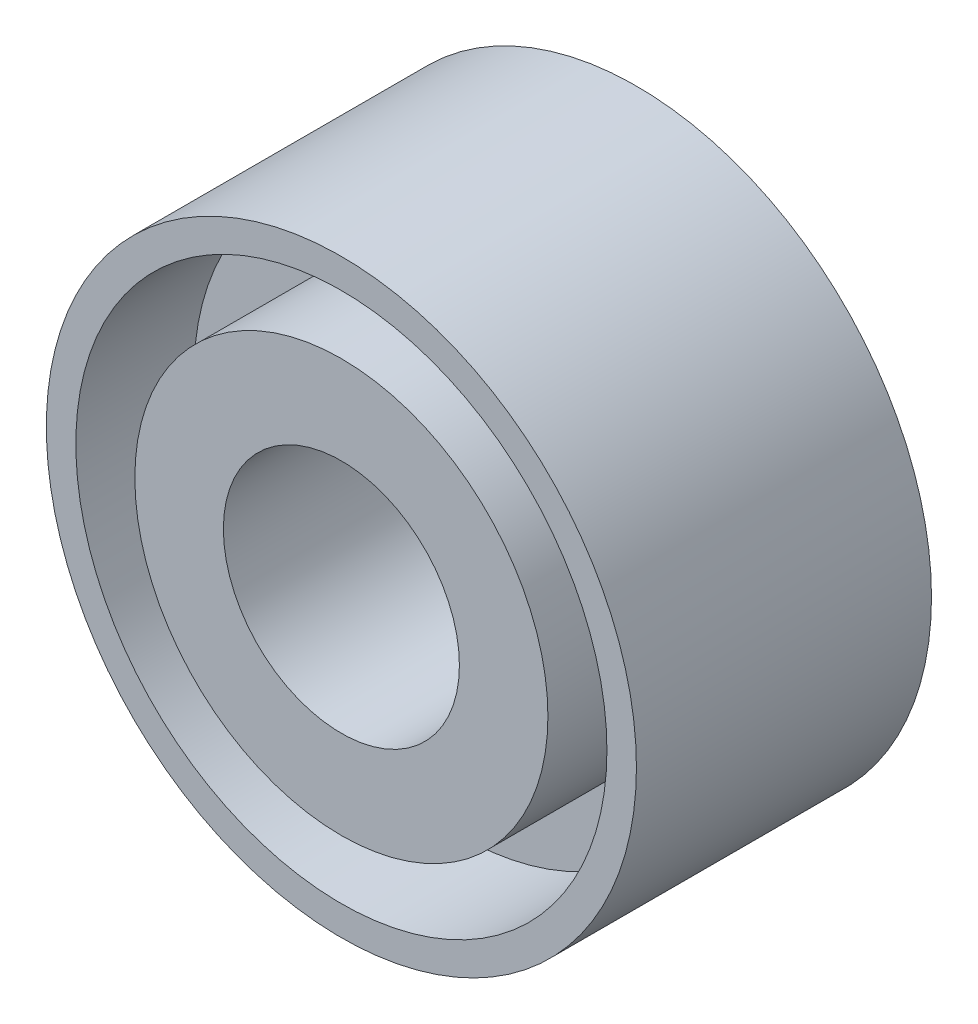
ISO-10303-21;
HEADER;
FILE_DESCRIPTION(('STEP AP214'),'2;1');
FILE_NAME('part.step','',(''),(''),'','','');
FILE_SCHEMA(('AUTOMOTIVE_DESIGN { 1 0 10303 214 1 1 1 1 }'));
ENDSEC;
DATA;
#1=APPLICATION_CONTEXT('core data for automotive mechanical design processes');
#2=APPLICATION_PROTOCOL_DEFINITION('international standard','automotive_design',2000,#1);
#3=PRODUCT_CONTEXT('',#1,'mechanical');
#4=PRODUCT('Part','Part','',(#3));
#5=PRODUCT_RELATED_PRODUCT_CATEGORY('part','',(#4));
#6=PRODUCT_DEFINITION_FORMATION('','',#4);
#7=PRODUCT_DEFINITION_CONTEXT('part definition',#1,'design');
#8=PRODUCT_DEFINITION('design','',#6,#7);
#9=PRODUCT_DEFINITION_SHAPE('','',#8);
#10=(LENGTH_UNIT() NAMED_UNIT(*) SI_UNIT(.MILLI.,.METRE.));
#11=(NAMED_UNIT(*) PLANE_ANGLE_UNIT() SI_UNIT($,.RADIAN.));
#12=(NAMED_UNIT(*) SI_UNIT($,.STERADIAN.) SOLID_ANGLE_UNIT());
#13=UNCERTAINTY_MEASURE_WITH_UNIT(LENGTH_MEASURE(1.E-05),#10,'distance_accuracy_value','');
#14=(GEOMETRIC_REPRESENTATION_CONTEXT(3) GLOBAL_UNCERTAINTY_ASSIGNED_CONTEXT((#13)) GLOBAL_UNIT_ASSIGNED_CONTEXT((#10,
#11,#12)) REPRESENTATION_CONTEXT('',''));
#15=CARTESIAN_POINT('',(0.,0.,0.));
#16=DIRECTION('',(0.,0.,1.));
#17=DIRECTION('',(1.,0.,0.));
#18=AXIS2_PLACEMENT_3D('',#15,#16,#17);
#19=CARTESIAN_POINT('',(0.,0.,5.));
#20=DIRECTION('',(0.,0.,1.));
#21=DIRECTION('',(1.,0.,0.));
#22=AXIS2_PLACEMENT_3D('',#19,#20,#21);
#23=PLANE('',#22);
#24=CARTESIAN_POINT('',(0.,0.,5.));
#25=DIRECTION('',(0.,0.,1.));
#26=DIRECTION('',(1.,0.,0.));
#27=AXIS2_PLACEMENT_3D('',#24,#25,#26);
#28=CIRCLE('',#27,2.);
#29=CARTESIAN_POINT('',(2.,0.,5.));
#30=VERTEX_POINT('',#29);
#31=EDGE_CURVE('E62',#30,#30,#28,.T.);
#32=ORIENTED_EDGE('',*,*,#31,.F.);
#33=EDGE_LOOP('',(#32));
#34=FACE_BOUND('',#33,.T.);
#35=CARTESIAN_POINT('',(0.,0.,5.));
#36=DIRECTION('',(0.,0.,1.));
#37=DIRECTION('',(1.,0.,0.));
#38=AXIS2_PLACEMENT_3D('',#35,#36,#37);
#39=CIRCLE('',#38,3.5);
#40=CARTESIAN_POINT('',(3.5,0.,5.));
#41=VERTEX_POINT('',#40);
#42=EDGE_CURVE('E80',#41,#41,#39,.T.);
#43=ORIENTED_EDGE('',*,*,#42,.T.);
#44=EDGE_LOOP('',(#43));
#45=FACE_BOUND('',#44,.T.);
#46=ADVANCED_FACE('F49',(#34,#45),#23,.T.);
#47=CARTESIAN_POINT('',(0.,0.,5.));
#48=DIRECTION('',(0.,0.,1.));
#49=DIRECTION('',(1.,0.,0.));
#50=AXIS2_PLACEMENT_3D('',#47,#48,#49);
#51=CIRCLE('',#50,4.5);
#52=CARTESIAN_POINT('',(4.5,0.,5.));
#53=VERTEX_POINT('',#52);
#54=EDGE_CURVE('E72',#53,#53,#51,.T.);
#55=ORIENTED_EDGE('',*,*,#54,.F.);
#56=EDGE_LOOP('',(#55));
#57=FACE_BOUND('',#56,.T.);
#58=CARTESIAN_POINT('',(0.,0.,5.));
#59=DIRECTION('',(0.,0.,1.));
#60=DIRECTION('',(1.,0.,0.));
#61=AXIS2_PLACEMENT_3D('',#58,#59,#60);
#62=CIRCLE('',#61,5.);
#63=CARTESIAN_POINT('',(5.,0.,5.));
#64=VERTEX_POINT('',#63);
#65=EDGE_CURVE('E11',#64,#64,#62,.T.);
#66=ORIENTED_EDGE('',*,*,#65,.T.);
#67=EDGE_LOOP('',(#66));
#68=FACE_BOUND('',#67,.T.);
#69=ADVANCED_FACE('F104',(#57,#68),#23,.T.);
#70=CARTESIAN_POINT('',(0.,0.,0.));
#71=DIRECTION('',(0.,0.,1.));
#72=DIRECTION('',(1.,0.,0.));
#73=AXIS2_PLACEMENT_3D('',#70,#71,#72);
#74=PLANE('',#73);
#75=CARTESIAN_POINT('',(0.,0.,0.));
#76=DIRECTION('',(0.,0.,1.));
#77=DIRECTION('',(1.,0.,0.));
#78=AXIS2_PLACEMENT_3D('',#75,#76,#77);
#79=CIRCLE('',#78,5.);
#80=CARTESIAN_POINT('',(5.,0.,0.));
#81=VERTEX_POINT('',#80);
#82=EDGE_CURVE('E53',#81,#81,#79,.T.);
#83=ORIENTED_EDGE('',*,*,#82,.F.);
#84=EDGE_LOOP('',(#83));
#85=FACE_BOUND('',#84,.T.);
#86=CARTESIAN_POINT('',(0.,0.,0.));
#87=DIRECTION('',(0.,0.,1.));
#88=DIRECTION('',(1.,0.,0.));
#89=AXIS2_PLACEMENT_3D('',#86,#87,#88);
#90=CIRCLE('',#89,2.);
#91=CARTESIAN_POINT('',(2.,0.,0.));
#92=VERTEX_POINT('',#91);
#93=EDGE_CURVE('E64',#92,#92,#90,.T.);
#94=ORIENTED_EDGE('',*,*,#93,.T.);
#95=EDGE_LOOP('',(#94));
#96=FACE_BOUND('',#95,.T.);
#97=ADVANCED_FACE('F106',(#85,#96),#74,.F.);
#98=CARTESIAN_POINT('',(0.,0.,5.));
#99=DIRECTION('',(0.,0.,-1.));
#100=DIRECTION('',(-1.,0.,0.));
#101=AXIS2_PLACEMENT_3D('',#98,#99,#100);
#102=CYLINDRICAL_SURFACE('',#101,5.);
#103=ORIENTED_EDGE('',*,*,#65,.F.);
#104=EDGE_LOOP('',(#103));
#105=FACE_BOUND('',#104,.T.);
#106=ORIENTED_EDGE('',*,*,#82,.T.);
#107=EDGE_LOOP('',(#106));
#108=FACE_BOUND('',#107,.T.);
#109=ADVANCED_FACE('F51',(#105,#108),#102,.T.);
#110=CARTESIAN_POINT('',(0.,0.,5.));
#111=DIRECTION('',(0.,0.,-1.));
#112=DIRECTION('',(-1.,0.,0.));
#113=AXIS2_PLACEMENT_3D('',#110,#111,#112);
#114=CYLINDRICAL_SURFACE('',#113,2.);
#115=ORIENTED_EDGE('',*,*,#31,.T.);
#116=EDGE_LOOP('',(#115));
#117=FACE_BOUND('',#116,.T.);
#118=ORIENTED_EDGE('',*,*,#93,.F.);
#119=EDGE_LOOP('',(#118));
#120=FACE_BOUND('',#119,.T.);
#121=ADVANCED_FACE('F100',(#117,#120),#114,.F.);
#122=CARTESIAN_POINT('',(0.,0.,3.));
#123=DIRECTION('',(0.,0.,1.));
#124=DIRECTION('',(1.,0.,0.));
#125=AXIS2_PLACEMENT_3D('',#122,#123,#124);
#126=CYLINDRICAL_SURFACE('',#125,4.5);
#127=CARTESIAN_POINT('',(0.,0.,3.));
#128=DIRECTION('',(0.,0.,1.));
#129=DIRECTION('',(1.,0.,0.));
#130=AXIS2_PLACEMENT_3D('',#127,#128,#129);
#131=CIRCLE('',#130,4.5);
#132=CARTESIAN_POINT('',(4.5,0.,3.));
#133=VERTEX_POINT('',#132);
#134=EDGE_CURVE('E68',#133,#133,#131,.T.);
#135=ORIENTED_EDGE('',*,*,#134,.F.);
#136=EDGE_LOOP('',(#135));
#137=FACE_BOUND('',#136,.T.);
#138=ORIENTED_EDGE('',*,*,#54,.T.);
#139=EDGE_LOOP('',(#138));
#140=FACE_BOUND('',#139,.T.);
#141=ADVANCED_FACE('F94',(#137,#140),#126,.F.);
#142=CARTESIAN_POINT('',(0.,0.,3.));
#143=DIRECTION('',(0.,0.,1.));
#144=DIRECTION('',(1.,0.,0.));
#145=AXIS2_PLACEMENT_3D('',#142,#143,#144);
#146=PLANE('',#145);
#147=CARTESIAN_POINT('',(0.,0.,3.));
#148=DIRECTION('',(0.,0.,1.));
#149=DIRECTION('',(1.,0.,0.));
#150=AXIS2_PLACEMENT_3D('',#147,#148,#149);
#151=CIRCLE('',#150,3.5);
#152=CARTESIAN_POINT('',(3.5,0.,3.));
#153=VERTEX_POINT('',#152);
#154=EDGE_CURVE('E76',#153,#153,#151,.T.);
#155=ORIENTED_EDGE('',*,*,#154,.F.);
#156=EDGE_LOOP('',(#155));
#157=FACE_BOUND('',#156,.T.);
#158=ORIENTED_EDGE('',*,*,#134,.T.);
#159=EDGE_LOOP('',(#158));
#160=FACE_BOUND('',#159,.T.);
#161=ADVANCED_FACE('F91',(#157,#160),#146,.T.);
#162=CARTESIAN_POINT('',(0.,0.,3.));
#163=DIRECTION('',(0.,0.,1.));
#164=DIRECTION('',(1.,0.,0.));
#165=AXIS2_PLACEMENT_3D('',#162,#163,#164);
#166=CYLINDRICAL_SURFACE('',#165,3.5);
#167=ORIENTED_EDGE('',*,*,#154,.T.);
#168=EDGE_LOOP('',(#167));
#169=FACE_BOUND('',#168,.T.);
#170=ORIENTED_EDGE('',*,*,#42,.F.);
#171=EDGE_LOOP('',(#170));
#172=FACE_BOUND('',#171,.T.);
#173=ADVANCED_FACE('F88',(#169,#172),#166,.T.);
#174=CLOSED_SHELL('',(#46,#69,#97,#109,#121,#141,#161,#173));
#175=MANIFOLD_SOLID_BREP('B2',#174);
#176=ADVANCED_BREP_SHAPE_REPRESENTATION('',(#18,#175),#14);
#177=SHAPE_DEFINITION_REPRESENTATION(#9,#176);
ENDSEC;
END-ISO-10303-21;
